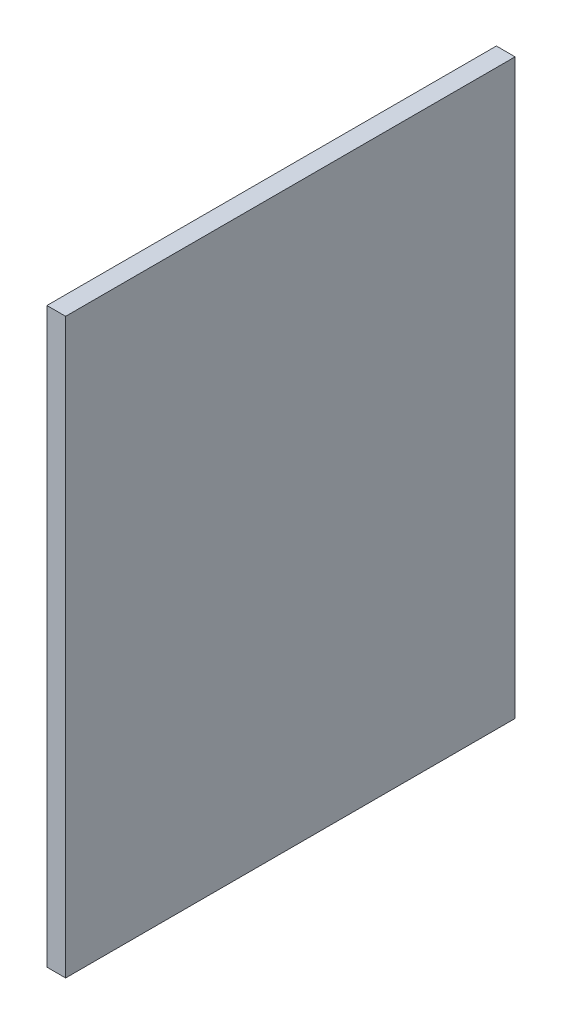
ISO-10303-21;
HEADER;
FILE_DESCRIPTION(('STEP AP214'),'2;1');
FILE_NAME('part.step','',(''),(''),'','','');
FILE_SCHEMA(('AUTOMOTIVE_DESIGN { 1 0 10303 214 1 1 1 1 }'));
ENDSEC;
DATA;
#1=APPLICATION_CONTEXT('core data for automotive mechanical design processes');
#2=APPLICATION_PROTOCOL_DEFINITION('international standard','automotive_design',2000,#1);
#3=PRODUCT_CONTEXT('',#1,'mechanical');
#4=PRODUCT('Part','Part','',(#3));
#5=PRODUCT_RELATED_PRODUCT_CATEGORY('part','',(#4));
#6=PRODUCT_DEFINITION_FORMATION('','',#4);
#7=PRODUCT_DEFINITION_CONTEXT('part definition',#1,'design');
#8=PRODUCT_DEFINITION('design','',#6,#7);
#9=PRODUCT_DEFINITION_SHAPE('','',#8);
#10=(LENGTH_UNIT() NAMED_UNIT(*) SI_UNIT(.MILLI.,.METRE.));
#11=(NAMED_UNIT(*) PLANE_ANGLE_UNIT() SI_UNIT($,.RADIAN.));
#12=(NAMED_UNIT(*) SI_UNIT($,.STERADIAN.) SOLID_ANGLE_UNIT());
#13=UNCERTAINTY_MEASURE_WITH_UNIT(LENGTH_MEASURE(1.E-05),#10,'distance_accuracy_value','');
#14=(GEOMETRIC_REPRESENTATION_CONTEXT(3) GLOBAL_UNCERTAINTY_ASSIGNED_CONTEXT((#13)) GLOBAL_UNIT_ASSIGNED_CONTEXT((#10,
#11,#12)) REPRESENTATION_CONTEXT('',''));
#15=CARTESIAN_POINT('',(0.,0.,0.));
#16=DIRECTION('',(0.,0.,1.));
#17=DIRECTION('',(1.,0.,0.));
#18=AXIS2_PLACEMENT_3D('',#15,#16,#17);
#19=CARTESIAN_POINT('',(0.,153.,0.));
#20=DIRECTION('',(0.,1.,0.));
#21=DIRECTION('',(0.,0.,1.));
#22=AXIS2_PLACEMENT_3D('',#19,#20,#21);
#23=PLANE('',#22);
#24=DIRECTION('',(0.,0.,-1.));
#25=VECTOR('',#24,1.);
#26=CARTESIAN_POINT('',(-760.231317194732,153.,7.02046736441133));
#27=LINE('',#26,#25);
#28=CARTESIAN_POINT('',(-760.231317194732,153.,127.020467364411));
#29=VERTEX_POINT('',#28);
#30=CARTESIAN_POINT('',(-760.231317194732,153.,7.02046736441133));
#31=VERTEX_POINT('',#30);
#32=EDGE_CURVE('E46',#29,#31,#27,.T.);
#33=ORIENTED_EDGE('',*,*,#32,.F.);
#34=DIRECTION('',(-1.,0.,0.));
#35=VECTOR('',#34,1.);
#36=CARTESIAN_POINT('',(-760.231317194732,153.,127.020467364411));
#37=LINE('',#36,#35);
#38=CARTESIAN_POINT('',(-755.231317194732,153.,127.020467364411));
#39=VERTEX_POINT('',#38);
#40=EDGE_CURVE('E69',#39,#29,#37,.T.);
#41=ORIENTED_EDGE('',*,*,#40,.F.);
#42=DIRECTION('',(0.,0.,1.));
#43=VECTOR('',#42,1.);
#44=CARTESIAN_POINT('',(-755.231317194732,153.,7.02046736441133));
#45=LINE('',#44,#43);
#46=CARTESIAN_POINT('',(-755.231317194732,153.,7.02046736441133));
#47=VERTEX_POINT('',#46);
#48=EDGE_CURVE('E74',#47,#39,#45,.T.);
#49=ORIENTED_EDGE('',*,*,#48,.F.);
#50=DIRECTION('',(1.,0.,0.));
#51=VECTOR('',#50,1.);
#52=CARTESIAN_POINT('',(-760.231317194732,153.,7.02046736441133));
#53=LINE('',#52,#51);
#54=EDGE_CURVE('E89',#31,#47,#53,.T.);
#55=ORIENTED_EDGE('',*,*,#54,.F.);
#56=EDGE_LOOP('',(#33,#41,#49,#55));
#57=FACE_BOUND('',#56,.T.);
#58=ADVANCED_FACE('F38',(#57),#23,.T.);
#59=CARTESIAN_POINT('',(0.,0.,0.));
#60=DIRECTION('',(0.,1.,0.));
#61=DIRECTION('',(0.,0.,1.));
#62=AXIS2_PLACEMENT_3D('',#59,#60,#61);
#63=PLANE('',#62);
#64=DIRECTION('',(0.,0.,-1.));
#65=VECTOR('',#64,1.);
#66=CARTESIAN_POINT('',(-760.231317194732,0.,7.02046736441133));
#67=LINE('',#66,#65);
#68=CARTESIAN_POINT('',(-760.231317194732,0.,127.020467364411));
#69=VERTEX_POINT('',#68);
#70=CARTESIAN_POINT('',(-760.231317194732,0.,7.02046736441133));
#71=VERTEX_POINT('',#70);
#72=EDGE_CURVE('E98',#69,#71,#67,.T.);
#73=ORIENTED_EDGE('',*,*,#72,.T.);
#74=DIRECTION('',(1.,0.,0.));
#75=VECTOR('',#74,1.);
#76=CARTESIAN_POINT('',(-760.231317194732,0.,7.02046736441133));
#77=LINE('',#76,#75);
#78=CARTESIAN_POINT('',(-755.231317194732,0.,7.02046736441133));
#79=VERTEX_POINT('',#78);
#80=EDGE_CURVE('E87',#71,#79,#77,.T.);
#81=ORIENTED_EDGE('',*,*,#80,.T.);
#82=DIRECTION('',(0.,0.,1.));
#83=VECTOR('',#82,1.);
#84=CARTESIAN_POINT('',(-755.231317194732,0.,7.02046736441133));
#85=LINE('',#84,#83);
#86=CARTESIAN_POINT('',(-755.231317194732,0.,127.020467364411));
#87=VERTEX_POINT('',#86);
#88=EDGE_CURVE('E90',#79,#87,#85,.T.);
#89=ORIENTED_EDGE('',*,*,#88,.T.);
#90=DIRECTION('',(-1.,0.,0.));
#91=VECTOR('',#90,1.);
#92=CARTESIAN_POINT('',(-760.231317194732,0.,127.020467364411));
#93=LINE('',#92,#91);
#94=EDGE_CURVE('E95',#87,#69,#93,.T.);
#95=ORIENTED_EDGE('',*,*,#94,.T.);
#96=EDGE_LOOP('',(#73,#81,#89,#95));
#97=FACE_BOUND('',#96,.T.);
#98=ADVANCED_FACE('F97',(#97),#63,.F.);
#99=CARTESIAN_POINT('',(-760.231317194732,273.104121494643,7.02046736441133));
#100=DIRECTION('',(0.,0.,-1.));
#101=DIRECTION('',(-1.,0.,0.));
#102=AXIS2_PLACEMENT_3D('',#99,#100,#101);
#103=PLANE('',#102);
#104=DIRECTION('',(0.,-1.,0.));
#105=VECTOR('',#104,1.);
#106=CARTESIAN_POINT('',(-760.231317194732,273.104121494643,7.02046736441133));
#107=LINE('',#106,#105);
#108=EDGE_CURVE('E11',#31,#71,#107,.T.);
#109=ORIENTED_EDGE('',*,*,#108,.F.);
#110=ORIENTED_EDGE('',*,*,#54,.T.);
#111=DIRECTION('',(0.,-1.,0.));
#112=VECTOR('',#111,1.);
#113=CARTESIAN_POINT('',(-755.231317194732,273.104121494643,7.02046736441133));
#114=LINE('',#113,#112);
#115=EDGE_CURVE('E84',#47,#79,#114,.T.);
#116=ORIENTED_EDGE('',*,*,#115,.T.);
#117=ORIENTED_EDGE('',*,*,#80,.F.);
#118=EDGE_LOOP('',(#109,#110,#116,#117));
#119=FACE_BOUND('',#118,.T.);
#120=ADVANCED_FACE('F85',(#119),#103,.T.);
#121=CARTESIAN_POINT('',(-755.231317194732,273.104121494643,7.02046736441133));
#122=DIRECTION('',(1.,0.,0.));
#123=DIRECTION('',(0.,0.,-1.));
#124=AXIS2_PLACEMENT_3D('',#121,#122,#123);
#125=PLANE('',#124);
#126=ORIENTED_EDGE('',*,*,#115,.F.);
#127=ORIENTED_EDGE('',*,*,#48,.T.);
#128=DIRECTION('',(0.,-1.,0.));
#129=VECTOR('',#128,1.);
#130=CARTESIAN_POINT('',(-755.231317194732,273.104121494643,127.020467364411));
#131=LINE('',#130,#129);
#132=EDGE_CURVE('E79',#39,#87,#131,.T.);
#133=ORIENTED_EDGE('',*,*,#132,.T.);
#134=ORIENTED_EDGE('',*,*,#88,.F.);
#135=EDGE_LOOP('',(#126,#127,#133,#134));
#136=FACE_BOUND('',#135,.T.);
#137=ADVANCED_FACE('F91',(#136),#125,.T.);
#138=CARTESIAN_POINT('',(-760.231317194732,273.104121494643,127.020467364411));
#139=DIRECTION('',(0.,0.,1.));
#140=DIRECTION('',(1.,0.,0.));
#141=AXIS2_PLACEMENT_3D('',#138,#139,#140);
#142=PLANE('',#141);
#143=ORIENTED_EDGE('',*,*,#132,.F.);
#144=ORIENTED_EDGE('',*,*,#40,.T.);
#145=DIRECTION('',(0.,-1.,0.));
#146=VECTOR('',#145,1.);
#147=CARTESIAN_POINT('',(-760.231317194732,273.104121494643,127.020467364411));
#148=LINE('',#147,#146);
#149=EDGE_CURVE('E105',#29,#69,#148,.T.);
#150=ORIENTED_EDGE('',*,*,#149,.T.);
#151=ORIENTED_EDGE('',*,*,#94,.F.);
#152=EDGE_LOOP('',(#143,#144,#150,#151));
#153=FACE_BOUND('',#152,.T.);
#154=ADVANCED_FACE('F111',(#153),#142,.T.);
#155=CARTESIAN_POINT('',(-760.231317194732,273.104121494643,7.02046736441133));
#156=DIRECTION('',(-1.,0.,0.));
#157=DIRECTION('',(0.,0.,1.));
#158=AXIS2_PLACEMENT_3D('',#155,#156,#157);
#159=PLANE('',#158);
#160=ORIENTED_EDGE('',*,*,#149,.F.);
#161=ORIENTED_EDGE('',*,*,#32,.T.);
#162=ORIENTED_EDGE('',*,*,#108,.T.);
#163=ORIENTED_EDGE('',*,*,#72,.F.);
#164=EDGE_LOOP('',(#160,#161,#162,#163));
#165=FACE_BOUND('',#164,.T.);
#166=ADVANCED_FACE('F112',(#165),#159,.T.);
#167=CLOSED_SHELL('',(#58,#98,#120,#137,#154,#166));
#168=MANIFOLD_SOLID_BREP('B2',#167);
#169=ADVANCED_BREP_SHAPE_REPRESENTATION('',(#18,#168),#14);
#170=SHAPE_DEFINITION_REPRESENTATION(#9,#169);
ENDSEC;
END-ISO-10303-21;
